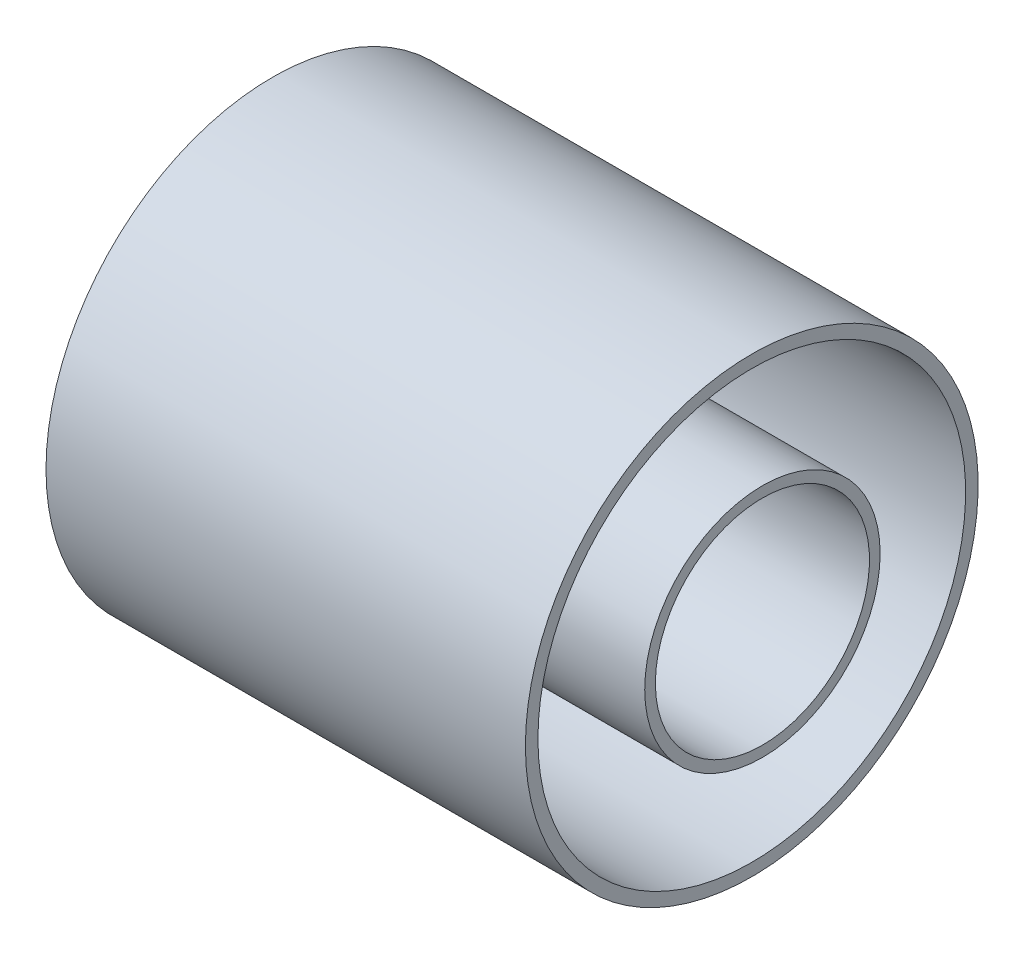
ISO-10303-21;
HEADER;
FILE_DESCRIPTION(('STEP AP214'),'2;1');
FILE_NAME('part.step','',(''),(''),'','','');
FILE_SCHEMA(('AUTOMOTIVE_DESIGN { 1 0 10303 214 1 1 1 1 }'));
ENDSEC;
DATA;
#1=APPLICATION_CONTEXT('core data for automotive mechanical design processes');
#2=APPLICATION_PROTOCOL_DEFINITION('international standard','automotive_design',2000,#1);
#3=PRODUCT_CONTEXT('',#1,'mechanical');
#4=PRODUCT('Part','Part','',(#3));
#5=PRODUCT_RELATED_PRODUCT_CATEGORY('part','',(#4));
#6=PRODUCT_DEFINITION_FORMATION('','',#4);
#7=PRODUCT_DEFINITION_CONTEXT('part definition',#1,'design');
#8=PRODUCT_DEFINITION('design','',#6,#7);
#9=PRODUCT_DEFINITION_SHAPE('','',#8);
#10=(LENGTH_UNIT() NAMED_UNIT(*) SI_UNIT(.MILLI.,.METRE.));
#11=(NAMED_UNIT(*) PLANE_ANGLE_UNIT() SI_UNIT($,.RADIAN.));
#12=(NAMED_UNIT(*) SI_UNIT($,.STERADIAN.) SOLID_ANGLE_UNIT());
#13=UNCERTAINTY_MEASURE_WITH_UNIT(LENGTH_MEASURE(1.E-05),#10,'distance_accuracy_value','');
#14=(GEOMETRIC_REPRESENTATION_CONTEXT(3) GLOBAL_UNCERTAINTY_ASSIGNED_CONTEXT((#13)) GLOBAL_UNIT_ASSIGNED_CONTEXT((#10,
#11,#12)) REPRESENTATION_CONTEXT('',''));
#15=CARTESIAN_POINT('',(0.,0.,0.));
#16=DIRECTION('',(0.,0.,1.));
#17=DIRECTION('',(1.,0.,0.));
#18=AXIS2_PLACEMENT_3D('',#15,#16,#17);
#19=CARTESIAN_POINT('',(-52.8819272646139,53.975,0.));
#20=DIRECTION('',(1.,0.,0.));
#21=DIRECTION('',(0.,0.,-1.));
#22=AXIS2_PLACEMENT_3D('',#19,#20,#21);
#23=PLANE('',#22);
#24=CARTESIAN_POINT('',(-52.8819272646139,0.,0.));
#25=DIRECTION('',(-1.,0.,0.));
#26=DIRECTION('',(0.,0.,1.));
#27=AXIS2_PLACEMENT_3D('',#24,#25,#26);
#28=CIRCLE('',#27,50.9905);
#29=CARTESIAN_POINT('',(-52.8819272646139,0.,50.9905));
#30=VERTEX_POINT('',#29);
#31=EDGE_CURVE('E57',#30,#30,#28,.T.);
#32=ORIENTED_EDGE('',*,*,#31,.F.);
#33=EDGE_LOOP('',(#32));
#34=FACE_BOUND('',#33,.T.);
#35=CARTESIAN_POINT('',(-52.8819272646139,0.,0.));
#36=DIRECTION('',(-1.,0.,0.));
#37=DIRECTION('',(0.,0.,1.));
#38=AXIS2_PLACEMENT_3D('',#35,#36,#37);
#39=CIRCLE('',#38,53.975);
#40=CARTESIAN_POINT('',(-52.8819272646139,0.,53.975));
#41=VERTEX_POINT('',#40);
#42=EDGE_CURVE('E11',#41,#41,#39,.T.);
#43=ORIENTED_EDGE('',*,*,#42,.T.);
#44=EDGE_LOOP('',(#43));
#45=FACE_BOUND('',#44,.T.);
#46=ADVANCED_FACE('F42',(#34,#45),#23,.F.);
#47=CARTESIAN_POINT('',(0.,0.,0.));
#48=DIRECTION('',(-1.,0.,0.));
#49=DIRECTION('',(0.,0.,1.));
#50=AXIS2_PLACEMENT_3D('',#47,#48,#49);
#51=CYLINDRICAL_SURFACE('',#50,50.9905);
#52=CARTESIAN_POINT('',(61.4180727353861,0.,0.));
#53=DIRECTION('',(-1.,0.,0.));
#54=DIRECTION('',(0.,0.,1.));
#55=AXIS2_PLACEMENT_3D('',#52,#53,#54);
#56=CIRCLE('',#55,50.9905);
#57=CARTESIAN_POINT('',(61.4180727353861,0.,50.9905));
#58=VERTEX_POINT('',#57);
#59=EDGE_CURVE('E53',#58,#58,#56,.T.);
#60=ORIENTED_EDGE('',*,*,#59,.F.);
#61=EDGE_LOOP('',(#60));
#62=FACE_BOUND('',#61,.T.);
#63=ORIENTED_EDGE('',*,*,#31,.T.);
#64=EDGE_LOOP('',(#63));
#65=FACE_BOUND('',#64,.T.);
#66=ADVANCED_FACE('F63',(#62,#65),#51,.F.);
#67=CARTESIAN_POINT('',(61.4180727353861,53.975,0.));
#68=DIRECTION('',(1.,0.,0.));
#69=DIRECTION('',(0.,0.,-1.));
#70=AXIS2_PLACEMENT_3D('',#67,#68,#69);
#71=PLANE('',#70);
#72=ORIENTED_EDGE('',*,*,#59,.T.);
#73=EDGE_LOOP('',(#72));
#74=FACE_BOUND('',#73,.T.);
#75=CARTESIAN_POINT('',(61.4180727353861,0.,0.));
#76=DIRECTION('',(-1.,0.,0.));
#77=DIRECTION('',(0.,0.,1.));
#78=AXIS2_PLACEMENT_3D('',#75,#76,#77);
#79=CIRCLE('',#78,53.975);
#80=CARTESIAN_POINT('',(61.4180727353861,0.,53.975));
#81=VERTEX_POINT('',#80);
#82=EDGE_CURVE('E49',#81,#81,#79,.T.);
#83=ORIENTED_EDGE('',*,*,#82,.F.);
#84=EDGE_LOOP('',(#83));
#85=FACE_BOUND('',#84,.T.);
#86=ADVANCED_FACE('F70',(#74,#85),#71,.T.);
#87=CARTESIAN_POINT('',(0.,0.,0.));
#88=DIRECTION('',(-1.,0.,0.));
#89=DIRECTION('',(0.,0.,1.));
#90=AXIS2_PLACEMENT_3D('',#87,#88,#89);
#91=CYLINDRICAL_SURFACE('',#90,53.975);
#92=ORIENTED_EDGE('',*,*,#82,.T.);
#93=EDGE_LOOP('',(#92));
#94=FACE_BOUND('',#93,.T.);
#95=ORIENTED_EDGE('',*,*,#42,.F.);
#96=EDGE_LOOP('',(#95));
#97=FACE_BOUND('',#96,.T.);
#98=ADVANCED_FACE('F44',(#94,#97),#91,.T.);
#99=CLOSED_SHELL('',(#46,#66,#86,#98));
#100=MANIFOLD_SOLID_BREP('B2',#99);
#101=CARTESIAN_POINT('',(-57.9111272646139,28.067,0.));
#102=DIRECTION('',(1.,0.,0.));
#103=DIRECTION('',(0.,0.,-1.));
#104=AXIS2_PLACEMENT_3D('',#101,#102,#103);
#105=PLANE('',#104);
#106=CARTESIAN_POINT('',(-57.9111272646139,0.,0.));
#107=DIRECTION('',(-1.,0.,0.));
#108=DIRECTION('',(0.,0.,1.));
#109=AXIS2_PLACEMENT_3D('',#106,#107,#108);
#110=CIRCLE('',#109,25.527);
#111=CARTESIAN_POINT('',(-57.9111272646139,0.,25.527));
#112=VERTEX_POINT('',#111);
#113=EDGE_CURVE('E41',#112,#112,#110,.T.);
#114=ORIENTED_EDGE('',*,*,#113,.F.);
#115=EDGE_LOOP('',(#114));
#116=FACE_BOUND('',#115,.T.);
#117=CARTESIAN_POINT('',(-57.9111272646139,0.,0.));
#118=DIRECTION('',(-1.,0.,0.));
#119=DIRECTION('',(0.,0.,1.));
#120=AXIS2_PLACEMENT_3D('',#117,#118,#119);
#121=CIRCLE('',#120,28.067);
#122=CARTESIAN_POINT('',(-57.9111272646139,0.,28.067));
#123=VERTEX_POINT('',#122);
#124=EDGE_CURVE('E125',#123,#123,#121,.T.);
#125=ORIENTED_EDGE('',*,*,#124,.T.);
#126=EDGE_LOOP('',(#125));
#127=FACE_BOUND('',#126,.T.);
#128=ADVANCED_FACE('F111',(#116,#127),#105,.F.);
#129=CARTESIAN_POINT('',(0.,0.,0.));
#130=DIRECTION('',(-1.,0.,0.));
#131=DIRECTION('',(0.,0.,1.));
#132=AXIS2_PLACEMENT_3D('',#129,#130,#131);
#133=CYLINDRICAL_SURFACE('',#132,25.527);
#134=CARTESIAN_POINT('',(63.958072735386,0.,0.));
#135=DIRECTION('',(-1.,0.,0.));
#136=DIRECTION('',(0.,0.,1.));
#137=AXIS2_PLACEMENT_3D('',#134,#135,#136);
#138=CIRCLE('',#137,25.527);
#139=CARTESIAN_POINT('',(63.958072735386,0.,25.527));
#140=VERTEX_POINT('',#139);
#141=EDGE_CURVE('E117',#140,#140,#138,.T.);
#142=ORIENTED_EDGE('',*,*,#141,.F.);
#143=EDGE_LOOP('',(#142));
#144=FACE_BOUND('',#143,.T.);
#145=ORIENTED_EDGE('',*,*,#113,.T.);
#146=EDGE_LOOP('',(#145));
#147=FACE_BOUND('',#146,.T.);
#148=ADVANCED_FACE('F140',(#144,#147),#133,.F.);
#149=CARTESIAN_POINT('',(63.958072735386,28.067,0.));
#150=DIRECTION('',(1.,0.,0.));
#151=DIRECTION('',(0.,0.,-1.));
#152=AXIS2_PLACEMENT_3D('',#149,#150,#151);
#153=PLANE('',#152);
#154=ORIENTED_EDGE('',*,*,#141,.T.);
#155=EDGE_LOOP('',(#154));
#156=FACE_BOUND('',#155,.T.);
#157=CARTESIAN_POINT('',(63.958072735386,0.,0.));
#158=DIRECTION('',(-1.,0.,0.));
#159=DIRECTION('',(0.,0.,1.));
#160=AXIS2_PLACEMENT_3D('',#157,#158,#159);
#161=CIRCLE('',#160,28.067);
#162=CARTESIAN_POINT('',(63.958072735386,0.,28.067));
#163=VERTEX_POINT('',#162);
#164=EDGE_CURVE('E121',#163,#163,#161,.T.);
#165=ORIENTED_EDGE('',*,*,#164,.F.);
#166=EDGE_LOOP('',(#165));
#167=FACE_BOUND('',#166,.T.);
#168=ADVANCED_FACE('F134',(#156,#167),#153,.T.);
#169=CARTESIAN_POINT('',(0.,0.,0.));
#170=DIRECTION('',(-1.,0.,0.));
#171=DIRECTION('',(0.,0.,1.));
#172=AXIS2_PLACEMENT_3D('',#169,#170,#171);
#173=CYLINDRICAL_SURFACE('',#172,28.067);
#174=ORIENTED_EDGE('',*,*,#164,.T.);
#175=EDGE_LOOP('',(#174));
#176=FACE_BOUND('',#175,.T.);
#177=ORIENTED_EDGE('',*,*,#124,.F.);
#178=EDGE_LOOP('',(#177));
#179=FACE_BOUND('',#178,.T.);
#180=ADVANCED_FACE('F132',(#176,#179),#173,.T.);
#181=CLOSED_SHELL('',(#128,#148,#168,#180));
#182=MANIFOLD_SOLID_BREP('B6',#181);
#183=ADVANCED_BREP_SHAPE_REPRESENTATION('',(#18,#100,#182),#14);
#184=SHAPE_DEFINITION_REPRESENTATION(#9,#183);
ENDSEC;
END-ISO-10303-21;
